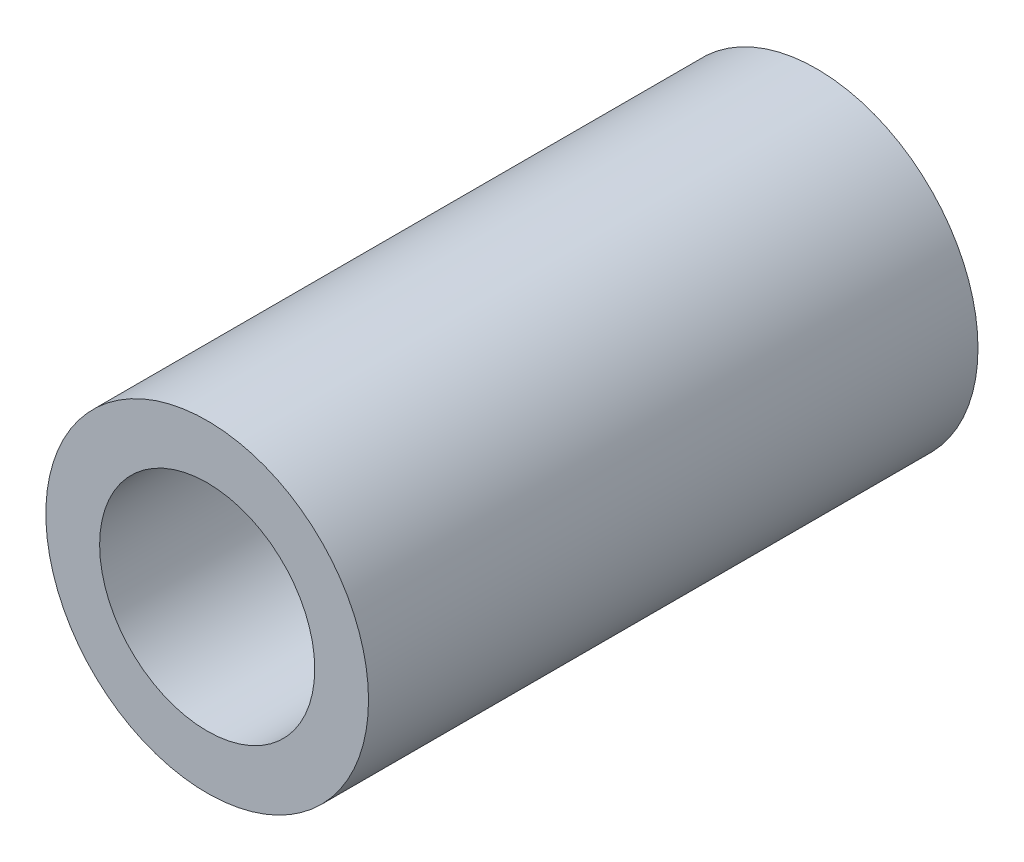
ISO-10303-21;
HEADER;
FILE_DESCRIPTION(('STEP AP214'),'2;1');
FILE_NAME('part.step','',(''),(''),'','','');
FILE_SCHEMA(('AUTOMOTIVE_DESIGN { 1 0 10303 214 1 1 1 1 }'));
ENDSEC;
DATA;
#1=APPLICATION_CONTEXT('core data for automotive mechanical design processes');
#2=APPLICATION_PROTOCOL_DEFINITION('international standard','automotive_design',2000,#1);
#3=PRODUCT_CONTEXT('',#1,'mechanical');
#4=PRODUCT('Part','Part','',(#3));
#5=PRODUCT_RELATED_PRODUCT_CATEGORY('part','',(#4));
#6=PRODUCT_DEFINITION_FORMATION('','',#4);
#7=PRODUCT_DEFINITION_CONTEXT('part definition',#1,'design');
#8=PRODUCT_DEFINITION('design','',#6,#7);
#9=PRODUCT_DEFINITION_SHAPE('','',#8);
#10=(LENGTH_UNIT() NAMED_UNIT(*) SI_UNIT(.MILLI.,.METRE.));
#11=(NAMED_UNIT(*) PLANE_ANGLE_UNIT() SI_UNIT($,.RADIAN.));
#12=(NAMED_UNIT(*) SI_UNIT($,.STERADIAN.) SOLID_ANGLE_UNIT());
#13=UNCERTAINTY_MEASURE_WITH_UNIT(LENGTH_MEASURE(1.E-05),#10,'distance_accuracy_value','');
#14=(GEOMETRIC_REPRESENTATION_CONTEXT(3) GLOBAL_UNCERTAINTY_ASSIGNED_CONTEXT((#13)) GLOBAL_UNIT_ASSIGNED_CONTEXT((#10,
#11,#12)) REPRESENTATION_CONTEXT('',''));
#15=CARTESIAN_POINT('',(0.,0.,0.));
#16=DIRECTION('',(0.,0.,1.));
#17=DIRECTION('',(1.,0.,0.));
#18=AXIS2_PLACEMENT_3D('',#15,#16,#17);
#19=CARTESIAN_POINT('',(0.,0.,17.));
#20=DIRECTION('',(0.,0.,1.));
#21=DIRECTION('',(1.,0.,0.));
#22=AXIS2_PLACEMENT_3D('',#19,#20,#21);
#23=PLANE('',#22);
#24=CARTESIAN_POINT('',(0.,0.,17.));
#25=DIRECTION('',(0.,0.,1.));
#26=DIRECTION('',(1.,0.,0.));
#27=AXIS2_PLACEMENT_3D('',#24,#25,#26);
#28=CIRCLE('',#27,9.);
#29=CARTESIAN_POINT('',(9.,0.,17.));
#30=VERTEX_POINT('',#29);
#31=EDGE_CURVE('E10',#30,#30,#28,.T.);
#32=ORIENTED_EDGE('',*,*,#31,.T.);
#33=EDGE_LOOP('',(#32));
#34=FACE_BOUND('',#33,.T.);
#35=CARTESIAN_POINT('',(0.,0.,17.));
#36=DIRECTION('',(0.,0.,1.));
#37=DIRECTION('',(1.,0.,0.));
#38=AXIS2_PLACEMENT_3D('',#35,#36,#37);
#39=CIRCLE('',#38,6.);
#40=CARTESIAN_POINT('',(6.,0.,17.));
#41=VERTEX_POINT('',#40);
#42=EDGE_CURVE('E50',#41,#41,#39,.T.);
#43=ORIENTED_EDGE('',*,*,#42,.F.);
#44=EDGE_LOOP('',(#43));
#45=FACE_BOUND('',#44,.T.);
#46=ADVANCED_FACE('F37',(#34,#45),#23,.T.);
#47=CARTESIAN_POINT('',(0.,0.,-17.));
#48=DIRECTION('',(0.,0.,1.));
#49=DIRECTION('',(1.,0.,0.));
#50=AXIS2_PLACEMENT_3D('',#47,#48,#49);
#51=PLANE('',#50);
#52=CARTESIAN_POINT('',(0.,0.,-17.));
#53=DIRECTION('',(0.,0.,1.));
#54=DIRECTION('',(1.,0.,0.));
#55=AXIS2_PLACEMENT_3D('',#52,#53,#54);
#56=CIRCLE('',#55,9.);
#57=CARTESIAN_POINT('',(9.,0.,-17.));
#58=VERTEX_POINT('',#57);
#59=EDGE_CURVE('E41',#58,#58,#56,.T.);
#60=ORIENTED_EDGE('',*,*,#59,.F.);
#61=EDGE_LOOP('',(#60));
#62=FACE_BOUND('',#61,.T.);
#63=CARTESIAN_POINT('',(0.,0.,-17.));
#64=DIRECTION('',(0.,0.,1.));
#65=DIRECTION('',(1.,0.,0.));
#66=AXIS2_PLACEMENT_3D('',#63,#64,#65);
#67=CIRCLE('',#66,6.);
#68=CARTESIAN_POINT('',(6.,0.,-17.));
#69=VERTEX_POINT('',#68);
#70=EDGE_CURVE('E52',#69,#69,#67,.T.);
#71=ORIENTED_EDGE('',*,*,#70,.T.);
#72=EDGE_LOOP('',(#71));
#73=FACE_BOUND('',#72,.T.);
#74=ADVANCED_FACE('F64',(#62,#73),#51,.F.);
#75=CARTESIAN_POINT('',(0.,0.,17.));
#76=DIRECTION('',(0.,0.,-1.));
#77=DIRECTION('',(-1.,0.,0.));
#78=AXIS2_PLACEMENT_3D('',#75,#76,#77);
#79=CYLINDRICAL_SURFACE('',#78,9.);
#80=ORIENTED_EDGE('',*,*,#31,.F.);
#81=EDGE_LOOP('',(#80));
#82=FACE_BOUND('',#81,.T.);
#83=ORIENTED_EDGE('',*,*,#59,.T.);
#84=EDGE_LOOP('',(#83));
#85=FACE_BOUND('',#84,.T.);
#86=ADVANCED_FACE('F39',(#82,#85),#79,.T.);
#87=CARTESIAN_POINT('',(0.,0.,17.));
#88=DIRECTION('',(0.,0.,-1.));
#89=DIRECTION('',(-1.,0.,0.));
#90=AXIS2_PLACEMENT_3D('',#87,#88,#89);
#91=CYLINDRICAL_SURFACE('',#90,6.);
#92=ORIENTED_EDGE('',*,*,#42,.T.);
#93=EDGE_LOOP('',(#92));
#94=FACE_BOUND('',#93,.T.);
#95=ORIENTED_EDGE('',*,*,#70,.F.);
#96=EDGE_LOOP('',(#95));
#97=FACE_BOUND('',#96,.T.);
#98=ADVANCED_FACE('F60',(#94,#97),#91,.F.);
#99=CLOSED_SHELL('',(#46,#74,#86,#98));
#100=MANIFOLD_SOLID_BREP('B2',#99);
#101=ADVANCED_BREP_SHAPE_REPRESENTATION('',(#18,#100),#14);
#102=SHAPE_DEFINITION_REPRESENTATION(#9,#101);
ENDSEC;
END-ISO-10303-21;
